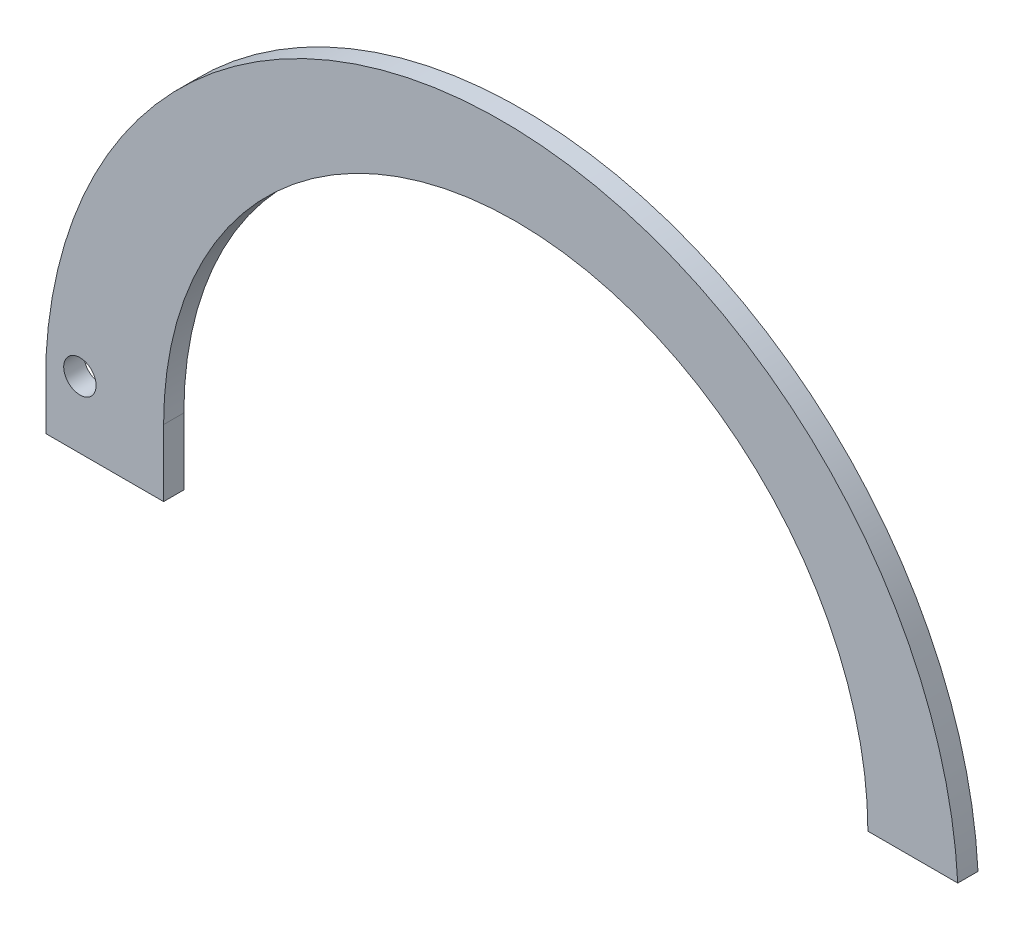
ISO-10303-21;
HEADER;
FILE_DESCRIPTION(('STEP AP214'),'2;1');
FILE_NAME('part.step','',(''),(''),'','','');
FILE_SCHEMA(('AUTOMOTIVE_DESIGN { 1 0 10303 214 1 1 1 1 }'));
ENDSEC;
DATA;
#1=APPLICATION_CONTEXT('core data for automotive mechanical design processes');
#2=APPLICATION_PROTOCOL_DEFINITION('international standard','automotive_design',2000,#1);
#3=PRODUCT_CONTEXT('',#1,'mechanical');
#4=PRODUCT('Part','Part','',(#3));
#5=PRODUCT_RELATED_PRODUCT_CATEGORY('part','',(#4));
#6=PRODUCT_DEFINITION_FORMATION('','',#4);
#7=PRODUCT_DEFINITION_CONTEXT('part definition',#1,'design');
#8=PRODUCT_DEFINITION('design','',#6,#7);
#9=PRODUCT_DEFINITION_SHAPE('','',#8);
#10=(LENGTH_UNIT() NAMED_UNIT(*) SI_UNIT(.MILLI.,.METRE.));
#11=(NAMED_UNIT(*) PLANE_ANGLE_UNIT() SI_UNIT($,.RADIAN.));
#12=(NAMED_UNIT(*) SI_UNIT($,.STERADIAN.) SOLID_ANGLE_UNIT());
#13=UNCERTAINTY_MEASURE_WITH_UNIT(LENGTH_MEASURE(1.E-05),#10,'distance_accuracy_value','');
#14=(GEOMETRIC_REPRESENTATION_CONTEXT(3) GLOBAL_UNCERTAINTY_ASSIGNED_CONTEXT((#13)) GLOBAL_UNIT_ASSIGNED_CONTEXT((#10,
#11,#12)) REPRESENTATION_CONTEXT('',''));
#15=CARTESIAN_POINT('',(0.,0.,0.));
#16=DIRECTION('',(0.,0.,1.));
#17=DIRECTION('',(1.,0.,0.));
#18=AXIS2_PLACEMENT_3D('',#15,#16,#17);
#19=CARTESIAN_POINT('',(104.195350707779,-5.98829222633296,5.));
#20=DIRECTION('',(0.,0.,-1.));
#21=DIRECTION('',(-1.,0.,0.));
#22=AXIS2_PLACEMENT_3D('',#19,#20,#21);
#23=PLANE('',#22);
#24=DIRECTION('',(0.,-1.,0.));
#25=VECTOR('',#24,1.);
#26=CARTESIAN_POINT('',(-8.37274089763179,-16.4756261449925,5.));
#27=LINE('',#26,#25);
#28=CARTESIAN_POINT('',(-8.37274089763179,0.,5.));
#29=VERTEX_POINT('',#28);
#30=CARTESIAN_POINT('',(-8.37274089763179,-16.4756261449925,5.));
#31=VERTEX_POINT('',#30);
#32=EDGE_CURVE('E129',#29,#31,#27,.T.);
#33=ORIENTED_EDGE('',*,*,#32,.T.);
#34=DIRECTION('',(1.,0.,0.));
#35=VECTOR('',#34,1.);
#36=CARTESIAN_POINT('',(-8.37274089763179,-16.4756261449925,5.));
#37=LINE('',#36,#35);
#38=CARTESIAN_POINT('',(20.6665638933292,-16.4756261449925,5.));
#39=VERTEX_POINT('',#38);
#40=EDGE_CURVE('E87',#31,#39,#37,.T.);
#41=ORIENTED_EDGE('',*,*,#40,.T.);
#42=DIRECTION('',(0.,1.,0.));
#43=VECTOR('',#42,1.);
#44=CARTESIAN_POINT('',(20.6665638933292,-16.4756261449925,5.));
#45=LINE('',#44,#43);
#46=CARTESIAN_POINT('',(20.6665638933292,0.,5.));
#47=VERTEX_POINT('',#46);
#48=EDGE_CURVE('E100',#39,#47,#45,.T.);
#49=ORIENTED_EDGE('',*,*,#48,.T.);
#50=CARTESIAN_POINT('',(107.621336104465,0.,5.));
#51=DIRECTION('',(0.,0.,-1.));
#52=DIRECTION('',(-1.,0.,0.));
#53=AXIS2_PLACEMENT_3D('',#50,#51,#52);
#54=CIRCLE('',#53,86.9547722111359);
#55=CARTESIAN_POINT('',(194.576108315601,0.,5.));
#56=VERTEX_POINT('',#55);
#57=EDGE_CURVE('E94',#47,#56,#54,.T.);
#58=ORIENTED_EDGE('',*,*,#57,.T.);
#59=DIRECTION('',(1.,0.,0.));
#60=VECTOR('',#59,1.);
#61=CARTESIAN_POINT('',(194.576108315601,0.,5.));
#62=LINE('',#61,#60);
#63=CARTESIAN_POINT('',(216.763442313189,0.,5.));
#64=VERTEX_POINT('',#63);
#65=EDGE_CURVE('E98',#56,#64,#62,.T.);
#66=ORIENTED_EDGE('',*,*,#65,.T.);
#67=CARTESIAN_POINT('',(104.195350707779,-5.98829222633296,5.));
#68=DIRECTION('',(0.,0.,1.));
#69=DIRECTION('',(-1.,0.,0.));
#70=AXIS2_PLACEMENT_3D('',#67,#68,#69);
#71=CIRCLE('',#70,112.727258866133);
#72=EDGE_CURVE('E50',#64,#29,#71,.T.);
#73=ORIENTED_EDGE('',*,*,#72,.T.);
#74=EDGE_LOOP('',(#33,#41,#49,#58,#66,#73));
#75=FACE_BOUND('',#74,.T.);
#76=CARTESIAN_POINT('',(0.,0.,5.));
#77=DIRECTION('',(0.,0.,1.));
#78=DIRECTION('',(1.,0.,0.));
#79=AXIS2_PLACEMENT_3D('',#76,#77,#78);
#80=CIRCLE('',#79,4.);
#81=CARTESIAN_POINT('',(4.,0.,5.));
#82=VERTEX_POINT('',#81);
#83=EDGE_CURVE('E122',#82,#82,#80,.T.);
#84=ORIENTED_EDGE('',*,*,#83,.F.);
#85=EDGE_LOOP('',(#84));
#86=FACE_BOUND('',#85,.T.);
#87=ADVANCED_FACE('F33',(#75,#86),#23,.F.);
#88=CARTESIAN_POINT('',(104.195350707779,-5.98829222633296,0.));
#89=DIRECTION('',(0.,0.,-1.));
#90=DIRECTION('',(-1.,0.,0.));
#91=AXIS2_PLACEMENT_3D('',#88,#89,#90);
#92=PLANE('',#91);
#93=DIRECTION('',(0.,-1.,0.));
#94=VECTOR('',#93,1.);
#95=CARTESIAN_POINT('',(-8.37274089763179,-16.4756261449925,0.));
#96=LINE('',#95,#94);
#97=CARTESIAN_POINT('',(-8.37274089763179,0.,0.));
#98=VERTEX_POINT('',#97);
#99=CARTESIAN_POINT('',(-8.37274089763179,-16.4756261449925,0.));
#100=VERTEX_POINT('',#99);
#101=EDGE_CURVE('E118',#98,#100,#96,.T.);
#102=ORIENTED_EDGE('',*,*,#101,.F.);
#103=CARTESIAN_POINT('',(104.195350707779,-5.98829222633296,0.));
#104=DIRECTION('',(0.,0.,1.));
#105=DIRECTION('',(-1.,0.,0.));
#106=AXIS2_PLACEMENT_3D('',#103,#104,#105);
#107=CIRCLE('',#106,112.727258866133);
#108=CARTESIAN_POINT('',(216.763442313189,0.,0.));
#109=VERTEX_POINT('',#108);
#110=EDGE_CURVE('E79',#109,#98,#107,.T.);
#111=ORIENTED_EDGE('',*,*,#110,.F.);
#112=DIRECTION('',(1.,0.,0.));
#113=VECTOR('',#112,1.);
#114=CARTESIAN_POINT('',(194.576108315601,0.,0.));
#115=LINE('',#114,#113);
#116=CARTESIAN_POINT('',(194.576108315601,0.,0.));
#117=VERTEX_POINT('',#116);
#118=EDGE_CURVE('E73',#117,#109,#115,.T.);
#119=ORIENTED_EDGE('',*,*,#118,.F.);
#120=CARTESIAN_POINT('',(107.621336104465,0.,0.));
#121=DIRECTION('',(0.,0.,-1.));
#122=DIRECTION('',(-1.,0.,0.));
#123=AXIS2_PLACEMENT_3D('',#120,#121,#122);
#124=CIRCLE('',#123,86.9547722111359);
#125=CARTESIAN_POINT('',(20.6665638933292,0.,0.));
#126=VERTEX_POINT('',#125);
#127=EDGE_CURVE('E108',#126,#117,#124,.T.);
#128=ORIENTED_EDGE('',*,*,#127,.F.);
#129=DIRECTION('',(0.,1.,0.));
#130=VECTOR('',#129,1.);
#131=CARTESIAN_POINT('',(20.6665638933292,-16.4756261449925,0.));
#132=LINE('',#131,#130);
#133=CARTESIAN_POINT('',(20.6665638933292,-16.4756261449925,0.));
#134=VERTEX_POINT('',#133);
#135=EDGE_CURVE('E124',#134,#126,#132,.T.);
#136=ORIENTED_EDGE('',*,*,#135,.F.);
#137=DIRECTION('',(1.,0.,0.));
#138=VECTOR('',#137,1.);
#139=CARTESIAN_POINT('',(-8.37274089763179,-16.4756261449925,0.));
#140=LINE('',#139,#138);
#141=EDGE_CURVE('E121',#100,#134,#140,.T.);
#142=ORIENTED_EDGE('',*,*,#141,.F.);
#143=EDGE_LOOP('',(#102,#111,#119,#128,#136,#142));
#144=FACE_BOUND('',#143,.T.);
#145=CARTESIAN_POINT('',(0.,0.,0.));
#146=DIRECTION('',(0.,0.,1.));
#147=DIRECTION('',(1.,0.,0.));
#148=AXIS2_PLACEMENT_3D('',#145,#146,#147);
#149=CIRCLE('',#148,4.);
#150=CARTESIAN_POINT('',(4.,0.,0.));
#151=VERTEX_POINT('',#150);
#152=EDGE_CURVE('E222',#151,#151,#149,.T.);
#153=ORIENTED_EDGE('',*,*,#152,.T.);
#154=EDGE_LOOP('',(#153));
#155=FACE_BOUND('',#154,.T.);
#156=ADVANCED_FACE('F138',(#144,#155),#92,.T.);
#157=CARTESIAN_POINT('',(-8.37274089763179,-16.4756261449925,5.));
#158=DIRECTION('',(1.,0.,0.));
#159=DIRECTION('',(0.,0.,-1.));
#160=AXIS2_PLACEMENT_3D('',#157,#158,#159);
#161=PLANE('',#160);
#162=ORIENTED_EDGE('',*,*,#101,.T.);
#163=DIRECTION('',(0.,0.,-1.));
#164=VECTOR('',#163,1.);
#165=CARTESIAN_POINT('',(-8.37274089763179,-16.4756261449925,5.));
#166=LINE('',#165,#164);
#167=EDGE_CURVE('E11',#31,#100,#166,.T.);
#168=ORIENTED_EDGE('',*,*,#167,.F.);
#169=ORIENTED_EDGE('',*,*,#32,.F.);
#170=DIRECTION('',(0.,0.,-1.));
#171=VECTOR('',#170,1.);
#172=CARTESIAN_POINT('',(-8.37274089763179,0.,5.));
#173=LINE('',#172,#171);
#174=EDGE_CURVE('E114',#29,#98,#173,.T.);
#175=ORIENTED_EDGE('',*,*,#174,.T.);
#176=EDGE_LOOP('',(#162,#168,#169,#175));
#177=FACE_BOUND('',#176,.T.);
#178=ADVANCED_FACE('F35',(#177),#161,.F.);
#179=CARTESIAN_POINT('',(-8.37274089763179,-16.4756261449925,5.));
#180=DIRECTION('',(0.,1.,0.));
#181=DIRECTION('',(0.,0.,1.));
#182=AXIS2_PLACEMENT_3D('',#179,#180,#181);
#183=PLANE('',#182);
#184=ORIENTED_EDGE('',*,*,#141,.T.);
#185=DIRECTION('',(0.,0.,-1.));
#186=VECTOR('',#185,1.);
#187=CARTESIAN_POINT('',(20.6665638933292,-16.4756261449925,5.));
#188=LINE('',#187,#186);
#189=EDGE_CURVE('E42',#39,#134,#188,.T.);
#190=ORIENTED_EDGE('',*,*,#189,.F.);
#191=ORIENTED_EDGE('',*,*,#40,.F.);
#192=ORIENTED_EDGE('',*,*,#167,.T.);
#193=EDGE_LOOP('',(#184,#190,#191,#192));
#194=FACE_BOUND('',#193,.T.);
#195=ADVANCED_FACE('F163',(#194),#183,.F.);
#196=CARTESIAN_POINT('',(20.6665638933292,-16.4756261449925,5.));
#197=DIRECTION('',(-1.,0.,0.));
#198=DIRECTION('',(0.,0.,1.));
#199=AXIS2_PLACEMENT_3D('',#196,#197,#198);
#200=PLANE('',#199);
#201=ORIENTED_EDGE('',*,*,#135,.T.);
#202=DIRECTION('',(0.,0.,-1.));
#203=VECTOR('',#202,1.);
#204=CARTESIAN_POINT('',(20.6665638933292,0.,5.));
#205=LINE('',#204,#203);
#206=EDGE_CURVE('E109',#47,#126,#205,.T.);
#207=ORIENTED_EDGE('',*,*,#206,.F.);
#208=ORIENTED_EDGE('',*,*,#48,.F.);
#209=ORIENTED_EDGE('',*,*,#189,.T.);
#210=EDGE_LOOP('',(#201,#207,#208,#209));
#211=FACE_BOUND('',#210,.T.);
#212=ADVANCED_FACE('F135',(#211),#200,.F.);
#213=CARTESIAN_POINT('',(107.621336104465,0.,5.));
#214=DIRECTION('',(0.,0.,-1.));
#215=DIRECTION('',(-1.,0.,0.));
#216=AXIS2_PLACEMENT_3D('',#213,#214,#215);
#217=CYLINDRICAL_SURFACE('',#216,86.9547722111359);
#218=ORIENTED_EDGE('',*,*,#127,.T.);
#219=DIRECTION('',(0.,0.,-1.));
#220=VECTOR('',#219,1.);
#221=CARTESIAN_POINT('',(194.576108315601,0.,5.));
#222=LINE('',#221,#220);
#223=EDGE_CURVE('E105',#56,#117,#222,.T.);
#224=ORIENTED_EDGE('',*,*,#223,.F.);
#225=ORIENTED_EDGE('',*,*,#57,.F.);
#226=ORIENTED_EDGE('',*,*,#206,.T.);
#227=EDGE_LOOP('',(#218,#224,#225,#226));
#228=FACE_BOUND('',#227,.T.);
#229=ADVANCED_FACE('F106',(#228),#217,.F.);
#230=CARTESIAN_POINT('',(194.576108315601,0.,5.));
#231=DIRECTION('',(0.,1.,0.));
#232=DIRECTION('',(0.,0.,1.));
#233=AXIS2_PLACEMENT_3D('',#230,#231,#232);
#234=PLANE('',#233);
#235=ORIENTED_EDGE('',*,*,#118,.T.);
#236=DIRECTION('',(0.,0.,-1.));
#237=VECTOR('',#236,1.);
#238=CARTESIAN_POINT('',(216.763442313189,0.,5.));
#239=LINE('',#238,#237);
#240=EDGE_CURVE('E110',#64,#109,#239,.T.);
#241=ORIENTED_EDGE('',*,*,#240,.F.);
#242=ORIENTED_EDGE('',*,*,#65,.F.);
#243=ORIENTED_EDGE('',*,*,#223,.T.);
#244=EDGE_LOOP('',(#235,#241,#242,#243));
#245=FACE_BOUND('',#244,.T.);
#246=ADVANCED_FACE('F112',(#245),#234,.F.);
#247=CARTESIAN_POINT('',(104.195350707779,-5.98829222633296,5.));
#248=DIRECTION('',(0.,0.,-1.));
#249=DIRECTION('',(-1.,0.,0.));
#250=AXIS2_PLACEMENT_3D('',#247,#248,#249);
#251=CYLINDRICAL_SURFACE('',#250,112.727258866133);
#252=ORIENTED_EDGE('',*,*,#110,.T.);
#253=ORIENTED_EDGE('',*,*,#174,.F.);
#254=ORIENTED_EDGE('',*,*,#72,.F.);
#255=ORIENTED_EDGE('',*,*,#240,.T.);
#256=EDGE_LOOP('',(#252,#253,#254,#255));
#257=FACE_BOUND('',#256,.T.);
#258=ADVANCED_FACE('F143',(#257),#251,.T.);
#259=CARTESIAN_POINT('',(0.,0.,5.));
#260=DIRECTION('',(0.,0.,-1.));
#261=DIRECTION('',(-1.,0.,0.));
#262=AXIS2_PLACEMENT_3D('',#259,#260,#261);
#263=CYLINDRICAL_SURFACE('',#262,4.);
#264=ORIENTED_EDGE('',*,*,#83,.T.);
#265=EDGE_LOOP('',(#264));
#266=FACE_BOUND('',#265,.T.);
#267=ORIENTED_EDGE('',*,*,#152,.F.);
#268=EDGE_LOOP('',(#267));
#269=FACE_BOUND('',#268,.T.);
#270=ADVANCED_FACE('F145',(#266,#269),#263,.F.);
#271=CLOSED_SHELL('',(#87,#156,#178,#195,#212,#229,#246,#258,#270));
#272=MANIFOLD_SOLID_BREP('B2',#271);
#273=ADVANCED_BREP_SHAPE_REPRESENTATION('',(#18,#272),#14);
#274=SHAPE_DEFINITION_REPRESENTATION(#9,#273);
ENDSEC;
END-ISO-10303-21;
